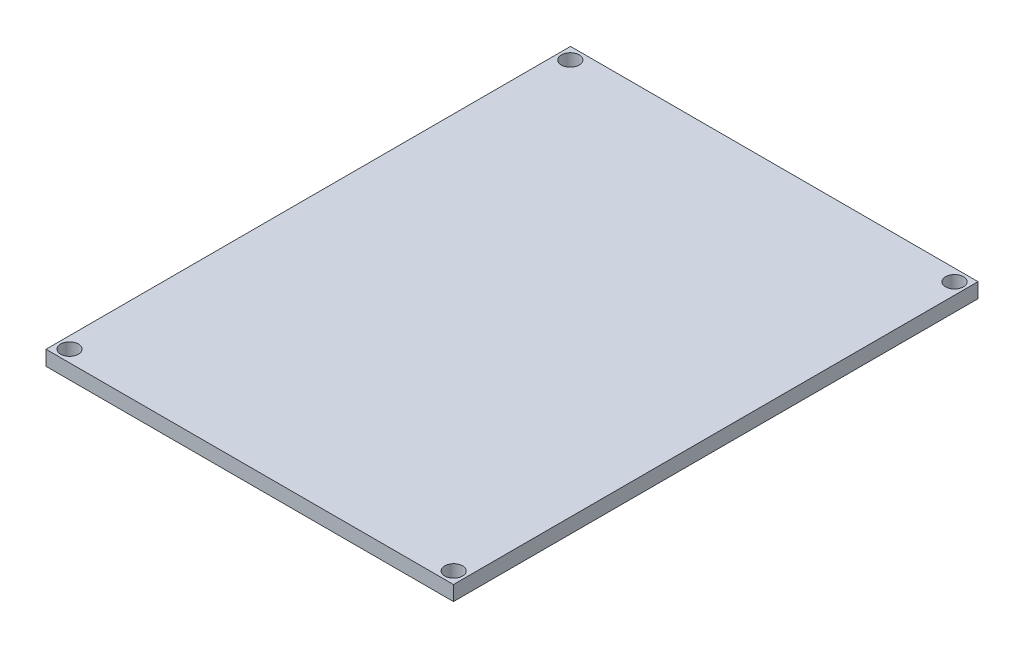
ISO-10303-21;
HEADER;
FILE_DESCRIPTION(('STEP AP214'),'2;1');
FILE_NAME('part.step','',(''),(''),'','','');
FILE_SCHEMA(('AUTOMOTIVE_DESIGN { 1 0 10303 214 1 1 1 1 }'));
ENDSEC;
DATA;
#1=APPLICATION_CONTEXT('core data for automotive mechanical design processes');
#2=APPLICATION_PROTOCOL_DEFINITION('international standard','automotive_design',2000,#1);
#3=PRODUCT_CONTEXT('',#1,'mechanical');
#4=PRODUCT('Part','Part','',(#3));
#5=PRODUCT_RELATED_PRODUCT_CATEGORY('part','',(#4));
#6=PRODUCT_DEFINITION_FORMATION('','',#4);
#7=PRODUCT_DEFINITION_CONTEXT('part definition',#1,'design');
#8=PRODUCT_DEFINITION('design','',#6,#7);
#9=PRODUCT_DEFINITION_SHAPE('','',#8);
#10=(LENGTH_UNIT() NAMED_UNIT(*) SI_UNIT(.MILLI.,.METRE.));
#11=(NAMED_UNIT(*) PLANE_ANGLE_UNIT() SI_UNIT($,.RADIAN.));
#12=(NAMED_UNIT(*) SI_UNIT($,.STERADIAN.) SOLID_ANGLE_UNIT());
#13=UNCERTAINTY_MEASURE_WITH_UNIT(LENGTH_MEASURE(1.E-05),#10,'distance_accuracy_value','');
#14=(GEOMETRIC_REPRESENTATION_CONTEXT(3) GLOBAL_UNCERTAINTY_ASSIGNED_CONTEXT((#13)) GLOBAL_UNIT_ASSIGNED_CONTEXT((#10,
#11,#12)) REPRESENTATION_CONTEXT('',''));
#15=CARTESIAN_POINT('',(0.,0.,0.));
#16=DIRECTION('',(0.,0.,1.));
#17=DIRECTION('',(1.,0.,0.));
#18=AXIS2_PLACEMENT_3D('',#15,#16,#17);
#19=CARTESIAN_POINT('',(34.925,1.27,44.958));
#20=DIRECTION('',(-1.,0.,0.));
#21=DIRECTION('',(0.,0.,1.));
#22=AXIS2_PLACEMENT_3D('',#19,#20,#21);
#23=PLANE('',#22);
#24=DIRECTION('',(0.,0.,-1.));
#25=VECTOR('',#24,1.);
#26=CARTESIAN_POINT('',(34.925,-1.27,44.958));
#27=LINE('',#26,#25);
#28=CARTESIAN_POINT('',(34.925,-1.27,44.958));
#29=VERTEX_POINT('',#28);
#30=CARTESIAN_POINT('',(34.925,-1.27,-44.958));
#31=VERTEX_POINT('',#30);
#32=EDGE_CURVE('E102',#29,#31,#27,.T.);
#33=ORIENTED_EDGE('',*,*,#32,.T.);
#34=DIRECTION('',(0.,-1.,0.));
#35=VECTOR('',#34,1.);
#36=CARTESIAN_POINT('',(34.925,1.27,-44.958));
#37=LINE('',#36,#35);
#38=CARTESIAN_POINT('',(34.925,1.27,-44.958));
#39=VERTEX_POINT('',#38);
#40=EDGE_CURVE('E11',#39,#31,#37,.T.);
#41=ORIENTED_EDGE('',*,*,#40,.F.);
#42=DIRECTION('',(0.,0.,-1.));
#43=VECTOR('',#42,1.);
#44=CARTESIAN_POINT('',(34.925,1.27,44.958));
#45=LINE('',#44,#43);
#46=CARTESIAN_POINT('',(34.925,1.27,44.958));
#47=VERTEX_POINT('',#46);
#48=EDGE_CURVE('E90',#47,#39,#45,.T.);
#49=ORIENTED_EDGE('',*,*,#48,.F.);
#50=DIRECTION('',(0.,-1.,0.));
#51=VECTOR('',#50,1.);
#52=CARTESIAN_POINT('',(34.925,1.27,44.958));
#53=LINE('',#52,#51);
#54=EDGE_CURVE('E98',#47,#29,#53,.T.);
#55=ORIENTED_EDGE('',*,*,#54,.T.);
#56=EDGE_LOOP('',(#33,#41,#49,#55));
#57=FACE_BOUND('',#56,.T.);
#58=ADVANCED_FACE('F39',(#57),#23,.F.);
#59=CARTESIAN_POINT('',(-34.925,1.27,-44.958));
#60=DIRECTION('',(0.,0.,1.));
#61=DIRECTION('',(1.,0.,0.));
#62=AXIS2_PLACEMENT_3D('',#59,#60,#61);
#63=PLANE('',#62);
#64=DIRECTION('',(-1.,0.,0.));
#65=VECTOR('',#64,1.);
#66=CARTESIAN_POINT('',(-34.925,-1.27,-44.958));
#67=LINE('',#66,#65);
#68=CARTESIAN_POINT('',(-34.925,-1.27,-44.958));
#69=VERTEX_POINT('',#68);
#70=EDGE_CURVE('E94',#31,#69,#67,.T.);
#71=ORIENTED_EDGE('',*,*,#70,.T.);
#72=DIRECTION('',(0.,-1.,0.));
#73=VECTOR('',#72,1.);
#74=CARTESIAN_POINT('',(-34.925,1.27,-44.958));
#75=LINE('',#74,#73);
#76=CARTESIAN_POINT('',(-34.925,1.27,-44.958));
#77=VERTEX_POINT('',#76);
#78=EDGE_CURVE('E47',#77,#69,#75,.T.);
#79=ORIENTED_EDGE('',*,*,#78,.F.);
#80=DIRECTION('',(-1.,0.,0.));
#81=VECTOR('',#80,1.);
#82=CARTESIAN_POINT('',(-34.925,1.27,-44.958));
#83=LINE('',#82,#81);
#84=EDGE_CURVE('E85',#39,#77,#83,.T.);
#85=ORIENTED_EDGE('',*,*,#84,.F.);
#86=ORIENTED_EDGE('',*,*,#40,.T.);
#87=EDGE_LOOP('',(#71,#79,#85,#86));
#88=FACE_BOUND('',#87,.T.);
#89=ADVANCED_FACE('F93',(#88),#63,.F.);
#90=CARTESIAN_POINT('',(-34.925,1.27,44.958));
#91=DIRECTION('',(1.,0.,0.));
#92=DIRECTION('',(0.,0.,-1.));
#93=AXIS2_PLACEMENT_3D('',#90,#91,#92);
#94=PLANE('',#93);
#95=DIRECTION('',(0.,0.,1.));
#96=VECTOR('',#95,1.);
#97=CARTESIAN_POINT('',(-34.925,-1.27,44.958));
#98=LINE('',#97,#96);
#99=CARTESIAN_POINT('',(-34.925,-1.27,44.958));
#100=VERTEX_POINT('',#99);
#101=EDGE_CURVE('E72',#69,#100,#98,.T.);
#102=ORIENTED_EDGE('',*,*,#101,.T.);
#103=DIRECTION('',(0.,-1.,0.));
#104=VECTOR('',#103,1.);
#105=CARTESIAN_POINT('',(-34.925,1.27,44.958));
#106=LINE('',#105,#104);
#107=CARTESIAN_POINT('',(-34.925,1.27,44.958));
#108=VERTEX_POINT('',#107);
#109=EDGE_CURVE('E95',#108,#100,#106,.T.);
#110=ORIENTED_EDGE('',*,*,#109,.F.);
#111=DIRECTION('',(0.,0.,1.));
#112=VECTOR('',#111,1.);
#113=CARTESIAN_POINT('',(-34.925,1.27,44.958));
#114=LINE('',#113,#112);
#115=EDGE_CURVE('E88',#77,#108,#114,.T.);
#116=ORIENTED_EDGE('',*,*,#115,.F.);
#117=ORIENTED_EDGE('',*,*,#78,.T.);
#118=EDGE_LOOP('',(#102,#110,#116,#117));
#119=FACE_BOUND('',#118,.T.);
#120=ADVANCED_FACE('F96',(#119),#94,.F.);
#121=CARTESIAN_POINT('',(-34.925,1.27,44.958));
#122=DIRECTION('',(0.,0.,-1.));
#123=DIRECTION('',(-1.,0.,0.));
#124=AXIS2_PLACEMENT_3D('',#121,#122,#123);
#125=PLANE('',#124);
#126=DIRECTION('',(1.,0.,0.));
#127=VECTOR('',#126,1.);
#128=CARTESIAN_POINT('',(-34.925,-1.27,44.958));
#129=LINE('',#128,#127);
#130=EDGE_CURVE('E78',#100,#29,#129,.T.);
#131=ORIENTED_EDGE('',*,*,#130,.T.);
#132=ORIENTED_EDGE('',*,*,#54,.F.);
#133=DIRECTION('',(1.,0.,0.));
#134=VECTOR('',#133,1.);
#135=CARTESIAN_POINT('',(-34.925,1.27,44.958));
#136=LINE('',#135,#134);
#137=EDGE_CURVE('E55',#108,#47,#136,.T.);
#138=ORIENTED_EDGE('',*,*,#137,.F.);
#139=ORIENTED_EDGE('',*,*,#109,.T.);
#140=EDGE_LOOP('',(#131,#132,#138,#139));
#141=FACE_BOUND('',#140,.T.);
#142=ADVANCED_FACE('F110',(#141),#125,.F.);
#143=CARTESIAN_POINT('',(0.,1.27,0.));
#144=DIRECTION('',(0.,-1.,0.));
#145=DIRECTION('',(0.,0.,-1.));
#146=AXIS2_PLACEMENT_3D('',#143,#144,#145);
#147=PLANE('',#146);
#148=CARTESIAN_POINT('',(-32.9311,1.27,42.926));
#149=DIRECTION('',(0.,1.,0.));
#150=DIRECTION('',(0.,0.,1.));
#151=AXIS2_PLACEMENT_3D('',#148,#149,#150);
#152=CIRCLE('',#151,1.524);
#153=CARTESIAN_POINT('',(-32.9311,1.27,44.45));
#154=VERTEX_POINT('',#153);
#155=EDGE_CURVE('E122',#154,#154,#152,.T.);
#156=ORIENTED_EDGE('',*,*,#155,.F.);
#157=EDGE_LOOP('',(#156));
#158=FACE_BOUND('',#157,.T.);
#159=CARTESIAN_POINT('',(32.9311,1.27,42.926));
#160=DIRECTION('',(0.,1.,0.));
#161=DIRECTION('',(0.,0.,1.));
#162=AXIS2_PLACEMENT_3D('',#159,#160,#161);
#163=CIRCLE('',#162,1.524);
#164=CARTESIAN_POINT('',(32.9311,1.27,44.45));
#165=VERTEX_POINT('',#164);
#166=EDGE_CURVE('E128',#165,#165,#163,.T.);
#167=ORIENTED_EDGE('',*,*,#166,.F.);
#168=EDGE_LOOP('',(#167));
#169=FACE_BOUND('',#168,.T.);
#170=CARTESIAN_POINT('',(32.9311,1.27,-42.926));
#171=DIRECTION('',(0.,1.,0.));
#172=DIRECTION('',(0.,0.,1.));
#173=AXIS2_PLACEMENT_3D('',#170,#171,#172);
#174=CIRCLE('',#173,1.524);
#175=CARTESIAN_POINT('',(32.9311,1.27,-41.402));
#176=VERTEX_POINT('',#175);
#177=EDGE_CURVE('E134',#176,#176,#174,.T.);
#178=ORIENTED_EDGE('',*,*,#177,.F.);
#179=EDGE_LOOP('',(#178));
#180=FACE_BOUND('',#179,.T.);
#181=CARTESIAN_POINT('',(-32.9311,1.27,-42.926));
#182=DIRECTION('',(0.,1.,0.));
#183=DIRECTION('',(0.,0.,1.));
#184=AXIS2_PLACEMENT_3D('',#181,#182,#183);
#185=CIRCLE('',#184,1.524);
#186=CARTESIAN_POINT('',(-32.9311,1.27,-41.402));
#187=VERTEX_POINT('',#186);
#188=EDGE_CURVE('E105',#187,#187,#185,.T.);
#189=ORIENTED_EDGE('',*,*,#188,.F.);
#190=EDGE_LOOP('',(#189));
#191=FACE_BOUND('',#190,.T.);
#192=ORIENTED_EDGE('',*,*,#48,.T.);
#193=ORIENTED_EDGE('',*,*,#84,.T.);
#194=ORIENTED_EDGE('',*,*,#115,.T.);
#195=ORIENTED_EDGE('',*,*,#137,.T.);
#196=EDGE_LOOP('',(#192,#193,#194,#195));
#197=FACE_BOUND('',#196,.T.);
#198=ADVANCED_FACE('F86',(#158,#169,#180,#191,#197),#147,.F.);
#199=CARTESIAN_POINT('',(0.,-1.27,0.));
#200=DIRECTION('',(0.,-1.,0.));
#201=DIRECTION('',(0.,0.,-1.));
#202=AXIS2_PLACEMENT_3D('',#199,#200,#201);
#203=PLANE('',#202);
#204=CARTESIAN_POINT('',(-32.9311,-1.27,42.926));
#205=DIRECTION('',(0.,-1.,0.));
#206=DIRECTION('',(0.,0.,-1.));
#207=AXIS2_PLACEMENT_3D('',#204,#205,#206);
#208=CIRCLE('',#207,1.524);
#209=CARTESIAN_POINT('',(-32.9311,-1.27,41.402));
#210=VERTEX_POINT('',#209);
#211=EDGE_CURVE('E125',#210,#210,#208,.F.);
#212=ORIENTED_EDGE('',*,*,#211,.T.);
#213=EDGE_LOOP('',(#212));
#214=FACE_BOUND('',#213,.T.);
#215=CARTESIAN_POINT('',(32.9311,-1.27,42.926));
#216=DIRECTION('',(0.,-1.,0.));
#217=DIRECTION('',(0.,0.,-1.));
#218=AXIS2_PLACEMENT_3D('',#215,#216,#217);
#219=CIRCLE('',#218,1.524);
#220=CARTESIAN_POINT('',(32.9311,-1.27,41.402));
#221=VERTEX_POINT('',#220);
#222=EDGE_CURVE('E131',#221,#221,#219,.F.);
#223=ORIENTED_EDGE('',*,*,#222,.T.);
#224=EDGE_LOOP('',(#223));
#225=FACE_BOUND('',#224,.T.);
#226=CARTESIAN_POINT('',(32.9311,-1.27,-42.926));
#227=DIRECTION('',(0.,-1.,0.));
#228=DIRECTION('',(0.,0.,-1.));
#229=AXIS2_PLACEMENT_3D('',#226,#227,#228);
#230=CIRCLE('',#229,1.524);
#231=CARTESIAN_POINT('',(32.9311,-1.27,-44.45));
#232=VERTEX_POINT('',#231);
#233=EDGE_CURVE('E119',#232,#232,#230,.F.);
#234=ORIENTED_EDGE('',*,*,#233,.T.);
#235=EDGE_LOOP('',(#234));
#236=FACE_BOUND('',#235,.T.);
#237=CARTESIAN_POINT('',(-32.9311,-1.27,-42.926));
#238=DIRECTION('',(0.,-1.,0.));
#239=DIRECTION('',(0.,0.,-1.));
#240=AXIS2_PLACEMENT_3D('',#237,#238,#239);
#241=CIRCLE('',#240,1.524);
#242=CARTESIAN_POINT('',(-32.9311,-1.27,-44.45));
#243=VERTEX_POINT('',#242);
#244=EDGE_CURVE('E116',#243,#243,#241,.F.);
#245=ORIENTED_EDGE('',*,*,#244,.T.);
#246=EDGE_LOOP('',(#245));
#247=FACE_BOUND('',#246,.T.);
#248=ORIENTED_EDGE('',*,*,#32,.F.);
#249=ORIENTED_EDGE('',*,*,#130,.F.);
#250=ORIENTED_EDGE('',*,*,#101,.F.);
#251=ORIENTED_EDGE('',*,*,#70,.F.);
#252=EDGE_LOOP('',(#248,#249,#250,#251));
#253=FACE_BOUND('',#252,.T.);
#254=ADVANCED_FACE('F113',(#214,#225,#236,#247,#253),#203,.T.);
#255=CARTESIAN_POINT('',(-32.9311,-1.271,-42.926));
#256=DIRECTION('',(0.,1.,0.));
#257=DIRECTION('',(0.,0.,1.));
#258=AXIS2_PLACEMENT_3D('',#255,#256,#257);
#259=CYLINDRICAL_SURFACE('',#258,1.524);
#260=ORIENTED_EDGE('',*,*,#244,.F.);
#261=EDGE_LOOP('',(#260));
#262=FACE_BOUND('',#261,.T.);
#263=ORIENTED_EDGE('',*,*,#188,.T.);
#264=EDGE_LOOP('',(#263));
#265=FACE_BOUND('',#264,.T.);
#266=ADVANCED_FACE('F146',(#262,#265),#259,.F.);
#267=CARTESIAN_POINT('',(32.9311,-1.271,-42.926));
#268=DIRECTION('',(0.,1.,0.));
#269=DIRECTION('',(0.,0.,1.));
#270=AXIS2_PLACEMENT_3D('',#267,#268,#269);
#271=CYLINDRICAL_SURFACE('',#270,1.524);
#272=ORIENTED_EDGE('',*,*,#233,.F.);
#273=EDGE_LOOP('',(#272));
#274=FACE_BOUND('',#273,.T.);
#275=ORIENTED_EDGE('',*,*,#177,.T.);
#276=EDGE_LOOP('',(#275));
#277=FACE_BOUND('',#276,.T.);
#278=ADVANCED_FACE('F142',(#274,#277),#271,.F.);
#279=CARTESIAN_POINT('',(32.9311,-1.271,42.926));
#280=DIRECTION('',(0.,1.,0.));
#281=DIRECTION('',(0.,0.,1.));
#282=AXIS2_PLACEMENT_3D('',#279,#280,#281);
#283=CYLINDRICAL_SURFACE('',#282,1.524);
#284=ORIENTED_EDGE('',*,*,#222,.F.);
#285=EDGE_LOOP('',(#284));
#286=FACE_BOUND('',#285,.T.);
#287=ORIENTED_EDGE('',*,*,#166,.T.);
#288=EDGE_LOOP('',(#287));
#289=FACE_BOUND('',#288,.T.);
#290=ADVANCED_FACE('F145',(#286,#289),#283,.F.);
#291=CARTESIAN_POINT('',(-32.9311,-1.271,42.926));
#292=DIRECTION('',(0.,1.,0.));
#293=DIRECTION('',(0.,0.,1.));
#294=AXIS2_PLACEMENT_3D('',#291,#292,#293);
#295=CYLINDRICAL_SURFACE('',#294,1.524);
#296=ORIENTED_EDGE('',*,*,#211,.F.);
#297=EDGE_LOOP('',(#296));
#298=FACE_BOUND('',#297,.T.);
#299=ORIENTED_EDGE('',*,*,#155,.T.);
#300=EDGE_LOOP('',(#299));
#301=FACE_BOUND('',#300,.T.);
#302=ADVANCED_FACE('F210',(#298,#301),#295,.F.);
#303=CLOSED_SHELL('',(#58,#89,#120,#142,#198,#254,#266,#278,#290,#302));
#304=MANIFOLD_SOLID_BREP('B2',#303);
#305=ADVANCED_BREP_SHAPE_REPRESENTATION('',(#18,#304),#14);
#306=SHAPE_DEFINITION_REPRESENTATION(#9,#305);
ENDSEC;
END-ISO-10303-21;
